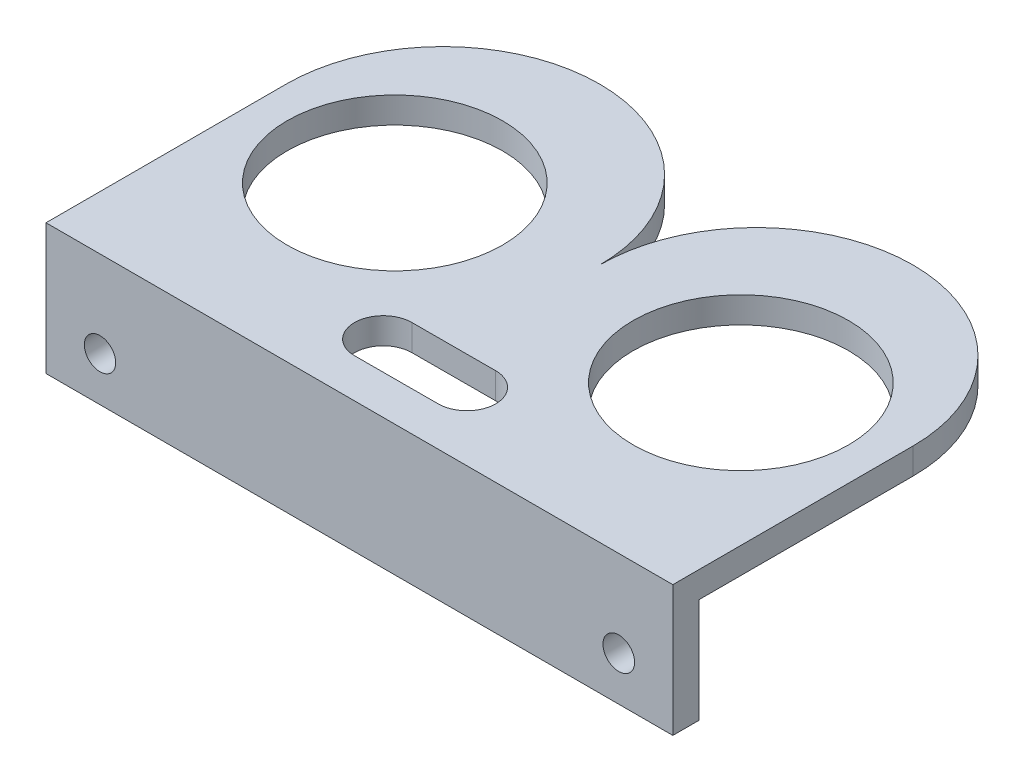
ISO-10303-21;
HEADER;
FILE_DESCRIPTION(('STEP AP214'),'2;1');
FILE_NAME('part.step','',(''),(''),'','','');
FILE_SCHEMA(('AUTOMOTIVE_DESIGN { 1 0 10303 214 1 1 1 1 }'));
ENDSEC;
DATA;
#1=APPLICATION_CONTEXT('core data for automotive mechanical design processes');
#2=APPLICATION_PROTOCOL_DEFINITION('international standard','automotive_design',2000,#1);
#3=PRODUCT_CONTEXT('',#1,'mechanical');
#4=PRODUCT('Part','Part','',(#3));
#5=PRODUCT_RELATED_PRODUCT_CATEGORY('part','',(#4));
#6=PRODUCT_DEFINITION_FORMATION('','',#4);
#7=PRODUCT_DEFINITION_CONTEXT('part definition',#1,'design');
#8=PRODUCT_DEFINITION('design','',#6,#7);
#9=PRODUCT_DEFINITION_SHAPE('','',#8);
#10=(LENGTH_UNIT() NAMED_UNIT(*) SI_UNIT(.MILLI.,.METRE.));
#11=(NAMED_UNIT(*) PLANE_ANGLE_UNIT() SI_UNIT($,.RADIAN.));
#12=(NAMED_UNIT(*) SI_UNIT($,.STERADIAN.) SOLID_ANGLE_UNIT());
#13=UNCERTAINTY_MEASURE_WITH_UNIT(LENGTH_MEASURE(1.E-05),#10,'distance_accuracy_value','');
#14=(GEOMETRIC_REPRESENTATION_CONTEXT(3) GLOBAL_UNCERTAINTY_ASSIGNED_CONTEXT((#13)) GLOBAL_UNIT_ASSIGNED_CONTEXT((#10,
#11,#12)) REPRESENTATION_CONTEXT('',''));
#15=CARTESIAN_POINT('',(0.,0.,0.));
#16=DIRECTION('',(0.,0.,1.));
#17=DIRECTION('',(1.,0.,0.));
#18=AXIS2_PLACEMENT_3D('',#15,#16,#17);
#19=CARTESIAN_POINT('',(0.,0.,-2.));
#20=DIRECTION('',(0.,0.,1.));
#21=DIRECTION('',(1.,0.,0.));
#22=AXIS2_PLACEMENT_3D('',#19,#20,#21);
#23=PLANE('',#22);
#24=CARTESIAN_POINT('',(-19.8645981954829,-1.61660108619209,-2.));
#25=DIRECTION('',(0.,0.,1.));
#26=DIRECTION('',(1.,0.,0.));
#27=AXIS2_PLACEMENT_3D('',#24,#25,#26);
#28=CIRCLE('',#27,1.2);
#29=CARTESIAN_POINT('',(-21.0645981954829,-1.61660108619209,-2.));
#30=VERTEX_POINT('',#29);
#31=EDGE_CURVE('E279',#30,#30,#28,.F.);
#32=ORIENTED_EDGE('',*,*,#31,.F.);
#33=EDGE_LOOP('',(#32));
#34=FACE_BOUND('',#33,.T.);
#35=CARTESIAN_POINT('',(19.86,-1.61660108619209,-2.));
#36=DIRECTION('',(0.,0.,1.));
#37=DIRECTION('',(1.,0.,0.));
#38=AXIS2_PLACEMENT_3D('',#35,#36,#37);
#39=CIRCLE('',#38,1.2118940059743);
#40=CARTESIAN_POINT('',(18.6481059940257,-1.61660108619209,-2.));
#41=VERTEX_POINT('',#40);
#42=EDGE_CURVE('E269',#41,#41,#39,.F.);
#43=ORIENTED_EDGE('',*,*,#42,.F.);
#44=EDGE_LOOP('',(#43));
#45=FACE_BOUND('',#44,.T.);
#46=DIRECTION('',(-1.,0.,0.));
#47=VECTOR('',#46,1.);
#48=CARTESIAN_POINT('',(-24.,3.,-2.));
#49=LINE('',#48,#47);
#50=CARTESIAN_POINT('',(24.,3.,-2.));
#51=VERTEX_POINT('',#50);
#52=CARTESIAN_POINT('',(-24.,3.,-2.));
#53=VERTEX_POINT('',#52);
#54=EDGE_CURVE('E199',#51,#53,#49,.T.);
#55=ORIENTED_EDGE('',*,*,#54,.F.);
#56=DIRECTION('',(0.,1.,0.));
#57=VECTOR('',#56,1.);
#58=CARTESIAN_POINT('',(24.,5.,-2.));
#59=LINE('',#58,#57);
#60=CARTESIAN_POINT('',(24.,-5.,-2.));
#61=VERTEX_POINT('',#60);
#62=EDGE_CURVE('E221',#61,#51,#59,.T.);
#63=ORIENTED_EDGE('',*,*,#62,.F.);
#64=DIRECTION('',(1.,0.,0.));
#65=VECTOR('',#64,1.);
#66=CARTESIAN_POINT('',(-24.,-5.,-2.));
#67=LINE('',#66,#65);
#68=CARTESIAN_POINT('',(-24.,-5.,-2.));
#69=VERTEX_POINT('',#68);
#70=EDGE_CURVE('E229',#69,#61,#67,.T.);
#71=ORIENTED_EDGE('',*,*,#70,.F.);
#72=DIRECTION('',(0.,-1.,0.));
#73=VECTOR('',#72,1.);
#74=CARTESIAN_POINT('',(-24.,5.,-2.));
#75=LINE('',#74,#73);
#76=EDGE_CURVE('E225',#53,#69,#75,.T.);
#77=ORIENTED_EDGE('',*,*,#76,.F.);
#78=EDGE_LOOP('',(#55,#63,#71,#77));
#79=FACE_BOUND('',#78,.T.);
#80=ADVANCED_FACE('F45',(#34,#45,#79),#23,.F.);
#81=CARTESIAN_POINT('',(24.,5.,-2.));
#82=DIRECTION('',(1.,0.,0.));
#83=DIRECTION('',(0.,1.,0.));
#84=AXIS2_PLACEMENT_3D('',#81,#82,#83);
#85=PLANE('',#84);
#86=DIRECTION('',(0.,1.,0.));
#87=VECTOR('',#86,1.);
#88=CARTESIAN_POINT('',(24.,5.,0.));
#89=LINE('',#88,#87);
#90=CARTESIAN_POINT('',(24.,-5.,0.));
#91=VERTEX_POINT('',#90);
#92=CARTESIAN_POINT('',(24.,5.,0.));
#93=VERTEX_POINT('',#92);
#94=EDGE_CURVE('E214',#91,#93,#89,.T.);
#95=ORIENTED_EDGE('',*,*,#94,.F.);
#96=DIRECTION('',(0.,0.,1.));
#97=VECTOR('',#96,1.);
#98=CARTESIAN_POINT('',(24.,-5.,-2.));
#99=LINE('',#98,#97);
#100=EDGE_CURVE('E248',#61,#91,#99,.T.);
#101=ORIENTED_EDGE('',*,*,#100,.F.);
#102=ORIENTED_EDGE('',*,*,#62,.T.);
#103=DIRECTION('',(0.,0.,-1.));
#104=VECTOR('',#103,1.);
#105=CARTESIAN_POINT('',(24.,3.,-2.));
#106=LINE('',#105,#104);
#107=CARTESIAN_POINT('',(24.,3.,-18.3975681348056));
#108=VERTEX_POINT('',#107);
#109=EDGE_CURVE('E183',#51,#108,#106,.T.);
#110=ORIENTED_EDGE('',*,*,#109,.T.);
#111=DIRECTION('',(0.,1.,0.));
#112=VECTOR('',#111,1.);
#113=CARTESIAN_POINT('',(24.,3.,-18.3975681348056));
#114=LINE('',#113,#112);
#115=CARTESIAN_POINT('',(24.,5.,-18.3975681348056));
#116=VERTEX_POINT('',#115);
#117=EDGE_CURVE('E203',#108,#116,#114,.T.);
#118=ORIENTED_EDGE('',*,*,#117,.T.);
#119=DIRECTION('',(0.,0.,1.));
#120=VECTOR('',#119,1.);
#121=CARTESIAN_POINT('',(24.,5.,-2.));
#122=LINE('',#121,#120);
#123=EDGE_CURVE('E233',#116,#93,#122,.T.);
#124=ORIENTED_EDGE('',*,*,#123,.T.);
#125=EDGE_LOOP('',(#95,#101,#102,#110,#118,#124));
#126=FACE_BOUND('',#125,.T.);
#127=ADVANCED_FACE('F47',(#126),#85,.T.);
#128=CARTESIAN_POINT('',(-24.,-5.,-2.));
#129=DIRECTION('',(0.,-1.,0.));
#130=DIRECTION('',(0.,0.,-1.));
#131=AXIS2_PLACEMENT_3D('',#128,#129,#130);
#132=PLANE('',#131);
#133=DIRECTION('',(1.,0.,0.));
#134=VECTOR('',#133,1.);
#135=CARTESIAN_POINT('',(-24.,-5.,0.));
#136=LINE('',#135,#134);
#137=CARTESIAN_POINT('',(-24.,-5.,0.));
#138=VERTEX_POINT('',#137);
#139=EDGE_CURVE('E226',#138,#91,#136,.T.);
#140=ORIENTED_EDGE('',*,*,#139,.F.);
#141=DIRECTION('',(0.,0.,1.));
#142=VECTOR('',#141,1.);
#143=CARTESIAN_POINT('',(-24.,-5.,-2.));
#144=LINE('',#143,#142);
#145=EDGE_CURVE('E252',#69,#138,#144,.T.);
#146=ORIENTED_EDGE('',*,*,#145,.F.);
#147=ORIENTED_EDGE('',*,*,#70,.T.);
#148=ORIENTED_EDGE('',*,*,#100,.T.);
#149=EDGE_LOOP('',(#140,#146,#147,#148));
#150=FACE_BOUND('',#149,.T.);
#151=ADVANCED_FACE('F314',(#150),#132,.T.);
#152=CARTESIAN_POINT('',(-24.,5.,-2.));
#153=DIRECTION('',(-1.,0.,0.));
#154=DIRECTION('',(0.,0.,1.));
#155=AXIS2_PLACEMENT_3D('',#152,#153,#154);
#156=PLANE('',#155);
#157=DIRECTION('',(0.,-1.,0.));
#158=VECTOR('',#157,1.);
#159=CARTESIAN_POINT('',(-24.,5.,0.));
#160=LINE('',#159,#158);
#161=CARTESIAN_POINT('',(-24.,5.,0.));
#162=VERTEX_POINT('',#161);
#163=EDGE_CURVE('E241',#162,#138,#160,.T.);
#164=ORIENTED_EDGE('',*,*,#163,.F.);
#165=DIRECTION('',(0.,0.,1.));
#166=VECTOR('',#165,1.);
#167=CARTESIAN_POINT('',(-24.,5.,-2.));
#168=LINE('',#167,#166);
#169=CARTESIAN_POINT('',(-24.,5.,-18.3975681348056));
#170=VERTEX_POINT('',#169);
#171=EDGE_CURVE('E255',#170,#162,#168,.T.);
#172=ORIENTED_EDGE('',*,*,#171,.F.);
#173=DIRECTION('',(0.,1.,0.));
#174=VECTOR('',#173,1.);
#175=CARTESIAN_POINT('',(-24.,3.,-18.3975681348056));
#176=LINE('',#175,#174);
#177=CARTESIAN_POINT('',(-24.,3.,-18.3975681348056));
#178=VERTEX_POINT('',#177);
#179=EDGE_CURVE('E210',#178,#170,#176,.T.);
#180=ORIENTED_EDGE('',*,*,#179,.F.);
#181=DIRECTION('',(0.,0.,-1.));
#182=VECTOR('',#181,1.);
#183=CARTESIAN_POINT('',(-24.,3.,-2.));
#184=LINE('',#183,#182);
#185=EDGE_CURVE('E196',#53,#178,#184,.T.);
#186=ORIENTED_EDGE('',*,*,#185,.F.);
#187=ORIENTED_EDGE('',*,*,#76,.T.);
#188=ORIENTED_EDGE('',*,*,#145,.T.);
#189=EDGE_LOOP('',(#164,#172,#180,#186,#187,#188));
#190=FACE_BOUND('',#189,.T.);
#191=ADVANCED_FACE('F316',(#190),#156,.T.);
#192=CARTESIAN_POINT('',(-24.,5.,-2.));
#193=DIRECTION('',(0.,1.,0.));
#194=DIRECTION('',(0.,0.,1.));
#195=AXIS2_PLACEMENT_3D('',#192,#193,#194);
#196=PLANE('',#195);
#197=CARTESIAN_POINT('',(-3.3694128577521,5.,-5.19393383521261));
#198=DIRECTION('',(0.,1.,0.));
#199=DIRECTION('',(0.,0.,1.));
#200=AXIS2_PLACEMENT_3D('',#197,#198,#199);
#201=CIRCLE('',#200,2.2);
#202=CARTESIAN_POINT('',(-3.37358064124707,5.,-7.39392988738651));
#203=VERTEX_POINT('',#202);
#204=CARTESIAN_POINT('',(-3.36524507425715,5.,-2.99393778303871));
#205=VERTEX_POINT('',#204);
#206=EDGE_CURVE('E63',#203,#205,#201,.T.);
#207=ORIENTED_EDGE('',*,*,#206,.F.);
#208=DIRECTION('',(-0.99999820553359,0.,0.00189444704316285));
#209=VECTOR('',#208,1.);
#210=CARTESIAN_POINT('',(-3.37358064124707,5.,-7.39392988738651));
#211=LINE('',#210,#209);
#212=CARTESIAN_POINT('',(3.02639354089853,5.,-7.40605432130908));
#213=VERTEX_POINT('',#212);
#214=EDGE_CURVE('E152',#213,#203,#211,.T.);
#215=ORIENTED_EDGE('',*,*,#214,.F.);
#216=CARTESIAN_POINT('',(3.03056132439349,5.,-5.20605826913519));
#217=DIRECTION('',(0.,1.,0.));
#218=DIRECTION('',(0.,0.,-1.));
#219=AXIS2_PLACEMENT_3D('',#216,#217,#218);
#220=CIRCLE('',#219,2.2);
#221=CARTESIAN_POINT('',(3.03472910788845,5.,-3.00606221696129));
#222=VERTEX_POINT('',#221);
#223=EDGE_CURVE('E134',#222,#213,#220,.T.);
#224=ORIENTED_EDGE('',*,*,#223,.F.);
#225=DIRECTION('',(0.99999820553359,0.,-0.00189444704316285));
#226=VECTOR('',#225,1.);
#227=CARTESIAN_POINT('',(-3.36524507425715,5.,-2.99393778303871));
#228=LINE('',#227,#226);
#229=EDGE_CURVE('E144',#205,#222,#228,.T.);
#230=ORIENTED_EDGE('',*,*,#229,.F.);
#231=EDGE_LOOP('',(#207,#215,#224,#230));
#232=FACE_BOUND('',#231,.T.);
#233=CARTESIAN_POINT('',(-13.2865314064832,5.,-15.9964745083174));
#234=DIRECTION('',(0.,1.,0.));
#235=DIRECTION('',(0.,0.,1.));
#236=AXIS2_PLACEMENT_3D('',#233,#234,#235);
#237=CIRCLE('',#236,8.25);
#238=CARTESIAN_POINT('',(-13.2865314064832,5.,-7.74647450831738));
#239=VERTEX_POINT('',#238);
#240=EDGE_CURVE('E172',#239,#239,#237,.T.);
#241=ORIENTED_EDGE('',*,*,#240,.F.);
#242=EDGE_LOOP('',(#241));
#243=FACE_BOUND('',#242,.T.);
#244=CARTESIAN_POINT('',(13.2134685935168,5.,-15.9964745083174));
#245=DIRECTION('',(0.,1.,0.));
#246=DIRECTION('',(0.,0.,1.));
#247=AXIS2_PLACEMENT_3D('',#244,#245,#246);
#248=CIRCLE('',#247,8.25);
#249=CARTESIAN_POINT('',(13.2134685935168,5.,-7.74647450831737));
#250=VERTEX_POINT('',#249);
#251=EDGE_CURVE('E176',#250,#250,#248,.T.);
#252=ORIENTED_EDGE('',*,*,#251,.F.);
#253=EDGE_LOOP('',(#252));
#254=FACE_BOUND('',#253,.T.);
#255=DIRECTION('',(-1.,0.,0.));
#256=VECTOR('',#255,1.);
#257=CARTESIAN_POINT('',(-24.,5.,0.));
#258=LINE('',#257,#256);
#259=EDGE_CURVE('E237',#93,#162,#258,.T.);
#260=ORIENTED_EDGE('',*,*,#259,.F.);
#261=ORIENTED_EDGE('',*,*,#123,.F.);
#262=CARTESIAN_POINT('',(12.,5.,-18.3975681348056));
#263=DIRECTION('',(0.,1.,0.));
#264=DIRECTION('',(0.,0.,1.));
#265=AXIS2_PLACEMENT_3D('',#262,#263,#264);
#266=CIRCLE('',#265,12.);
#267=CARTESIAN_POINT('',(0.,5.,-18.3975681348056));
#268=VERTEX_POINT('',#267);
#269=EDGE_CURVE('E171',#116,#268,#266,.T.);
#270=ORIENTED_EDGE('',*,*,#269,.T.);
#271=CARTESIAN_POINT('',(-12.,5.,-18.3975681348056));
#272=DIRECTION('',(0.,1.,0.));
#273=DIRECTION('',(0.,0.,1.));
#274=AXIS2_PLACEMENT_3D('',#271,#272,#273);
#275=CIRCLE('',#274,12.);
#276=EDGE_CURVE('E188',#268,#170,#275,.T.);
#277=ORIENTED_EDGE('',*,*,#276,.T.);
#278=ORIENTED_EDGE('',*,*,#171,.T.);
#279=EDGE_LOOP('',(#260,#261,#270,#277,#278));
#280=FACE_BOUND('',#279,.T.);
#281=ADVANCED_FACE('F149',(#232,#243,#254,#280),#196,.T.);
#282=CARTESIAN_POINT('',(0.,0.,0.));
#283=DIRECTION('',(0.,0.,1.));
#284=DIRECTION('',(1.,0.,0.));
#285=AXIS2_PLACEMENT_3D('',#282,#283,#284);
#286=PLANE('',#285);
#287=CARTESIAN_POINT('',(-19.8645981954829,-1.61660108619209,0.));
#288=DIRECTION('',(0.,0.,1.));
#289=DIRECTION('',(1.,0.,0.));
#290=AXIS2_PLACEMENT_3D('',#287,#288,#289);
#291=CIRCLE('',#290,1.2);
#292=CARTESIAN_POINT('',(-21.0645981954829,-1.61660108619209,0.));
#293=VERTEX_POINT('',#292);
#294=EDGE_CURVE('E49',#293,#293,#291,.F.);
#295=ORIENTED_EDGE('',*,*,#294,.T.);
#296=EDGE_LOOP('',(#295));
#297=FACE_BOUND('',#296,.T.);
#298=CARTESIAN_POINT('',(19.86,-1.61660108619209,0.));
#299=DIRECTION('',(0.,0.,1.));
#300=DIRECTION('',(1.,0.,0.));
#301=AXIS2_PLACEMENT_3D('',#298,#299,#300);
#302=CIRCLE('',#301,1.2118940059743);
#303=CARTESIAN_POINT('',(18.6481059940257,-1.61660108619209,0.));
#304=VERTEX_POINT('',#303);
#305=EDGE_CURVE('E266',#304,#304,#302,.F.);
#306=ORIENTED_EDGE('',*,*,#305,.T.);
#307=EDGE_LOOP('',(#306));
#308=FACE_BOUND('',#307,.T.);
#309=ORIENTED_EDGE('',*,*,#94,.T.);
#310=ORIENTED_EDGE('',*,*,#259,.T.);
#311=ORIENTED_EDGE('',*,*,#163,.T.);
#312=ORIENTED_EDGE('',*,*,#139,.T.);
#313=EDGE_LOOP('',(#309,#310,#311,#312));
#314=FACE_BOUND('',#313,.T.);
#315=ADVANCED_FACE('F310',(#297,#308,#314),#286,.T.);
#316=CARTESIAN_POINT('',(-12.,3.,-18.3975681348056));
#317=DIRECTION('',(0.,1.,0.));
#318=DIRECTION('',(0.,0.,1.));
#319=AXIS2_PLACEMENT_3D('',#316,#317,#318);
#320=CYLINDRICAL_SURFACE('',#319,12.);
#321=ORIENTED_EDGE('',*,*,#276,.F.);
#322=DIRECTION('',(0.,1.,0.));
#323=VECTOR('',#322,1.);
#324=CARTESIAN_POINT('',(0.,3.,-18.3975681348056));
#325=LINE('',#324,#323);
#326=CARTESIAN_POINT('',(0.,3.,-18.3975681348056));
#327=VERTEX_POINT('',#326);
#328=EDGE_CURVE('E215',#327,#268,#325,.T.);
#329=ORIENTED_EDGE('',*,*,#328,.F.);
#330=CARTESIAN_POINT('',(-12.,3.,-18.3975681348056));
#331=DIRECTION('',(0.,1.,0.));
#332=DIRECTION('',(0.,0.,1.));
#333=AXIS2_PLACEMENT_3D('',#330,#331,#332);
#334=CIRCLE('',#333,12.);
#335=EDGE_CURVE('E192',#327,#178,#334,.T.);
#336=ORIENTED_EDGE('',*,*,#335,.T.);
#337=ORIENTED_EDGE('',*,*,#179,.T.);
#338=EDGE_LOOP('',(#321,#329,#336,#337));
#339=FACE_BOUND('',#338,.T.);
#340=ADVANCED_FACE('F319',(#339),#320,.T.);
#341=CARTESIAN_POINT('',(12.,3.,-18.3975681348056));
#342=DIRECTION('',(0.,1.,0.));
#343=DIRECTION('',(0.,0.,1.));
#344=AXIS2_PLACEMENT_3D('',#341,#342,#343);
#345=CYLINDRICAL_SURFACE('',#344,12.);
#346=ORIENTED_EDGE('',*,*,#269,.F.);
#347=ORIENTED_EDGE('',*,*,#117,.F.);
#348=CARTESIAN_POINT('',(12.,3.,-18.3975681348056));
#349=DIRECTION('',(0.,1.,0.));
#350=DIRECTION('',(0.,0.,1.));
#351=AXIS2_PLACEMENT_3D('',#348,#349,#350);
#352=CIRCLE('',#351,12.);
#353=EDGE_CURVE('E187',#108,#327,#352,.T.);
#354=ORIENTED_EDGE('',*,*,#353,.T.);
#355=ORIENTED_EDGE('',*,*,#328,.T.);
#356=EDGE_LOOP('',(#346,#347,#354,#355));
#357=FACE_BOUND('',#356,.T.);
#358=ADVANCED_FACE('F304',(#357),#345,.T.);
#359=CARTESIAN_POINT('',(12.,3.,-18.3975681348056));
#360=DIRECTION('',(0.,1.,0.));
#361=DIRECTION('',(0.,0.,1.));
#362=AXIS2_PLACEMENT_3D('',#359,#360,#361);
#363=PLANE('',#362);
#364=DIRECTION('',(-0.99999820553359,0.,0.00189444704316285));
#365=VECTOR('',#364,1.);
#366=CARTESIAN_POINT('',(12.0207905978361,3.,-7.42309376079533));
#367=LINE('',#366,#365);
#368=CARTESIAN_POINT('',(3.02639354089853,3.,-7.40605432130908));
#369=VERTEX_POINT('',#368);
#370=CARTESIAN_POINT('',(-3.37358064124707,3.,-7.39392988738651));
#371=VERTEX_POINT('',#370);
#372=EDGE_CURVE('E55',#369,#371,#367,.T.);
#373=ORIENTED_EDGE('',*,*,#372,.T.);
#374=CARTESIAN_POINT('',(-3.3694128577521,3.,-5.19393383521261));
#375=DIRECTION('',(0.,1.,0.));
#376=DIRECTION('',(0.,0.,1.));
#377=AXIS2_PLACEMENT_3D('',#374,#375,#376);
#378=CIRCLE('',#377,2.2);
#379=CARTESIAN_POINT('',(-3.36524507425715,3.,-2.99393778303871));
#380=VERTEX_POINT('',#379);
#381=EDGE_CURVE('E11',#371,#380,#378,.T.);
#382=ORIENTED_EDGE('',*,*,#381,.T.);
#383=DIRECTION('',(0.99999820553359,0.,-0.00189444704316285));
#384=VECTOR('',#383,1.);
#385=CARTESIAN_POINT('',(12.0291261648261,3.,-3.02310165644753));
#386=LINE('',#385,#384);
#387=CARTESIAN_POINT('',(3.03472910788845,3.,-3.00606221696128));
#388=VERTEX_POINT('',#387);
#389=EDGE_CURVE('E251',#380,#388,#386,.T.);
#390=ORIENTED_EDGE('',*,*,#389,.T.);
#391=CARTESIAN_POINT('',(3.03056132439349,3.,-5.20605826913519));
#392=DIRECTION('',(0.,1.,0.));
#393=DIRECTION('',(0.,0.,1.));
#394=AXIS2_PLACEMENT_3D('',#391,#392,#393);
#395=CIRCLE('',#394,2.2);
#396=EDGE_CURVE('E137',#388,#369,#395,.T.);
#397=ORIENTED_EDGE('',*,*,#396,.T.);
#398=EDGE_LOOP('',(#373,#382,#390,#397));
#399=FACE_BOUND('',#398,.T.);
#400=CARTESIAN_POINT('',(-13.2865314064832,3.,-15.9964745083174));
#401=DIRECTION('',(0.,1.,0.));
#402=DIRECTION('',(0.,0.,1.));
#403=AXIS2_PLACEMENT_3D('',#400,#401,#402);
#404=CIRCLE('',#403,8.25);
#405=CARTESIAN_POINT('',(-13.2865314064832,3.,-7.74647450831738));
#406=VERTEX_POINT('',#405);
#407=EDGE_CURVE('E167',#406,#406,#404,.T.);
#408=ORIENTED_EDGE('',*,*,#407,.T.);
#409=EDGE_LOOP('',(#408));
#410=FACE_BOUND('',#409,.T.);
#411=CARTESIAN_POINT('',(13.2134685935168,3.,-15.9964745083174));
#412=DIRECTION('',(0.,1.,0.));
#413=DIRECTION('',(0.,0.,1.));
#414=AXIS2_PLACEMENT_3D('',#411,#412,#413);
#415=CIRCLE('',#414,8.25);
#416=CARTESIAN_POINT('',(13.2134685935168,3.,-7.74647450831737));
#417=VERTEX_POINT('',#416);
#418=EDGE_CURVE('E162',#417,#417,#415,.T.);
#419=ORIENTED_EDGE('',*,*,#418,.T.);
#420=EDGE_LOOP('',(#419));
#421=FACE_BOUND('',#420,.T.);
#422=ORIENTED_EDGE('',*,*,#109,.F.);
#423=ORIENTED_EDGE('',*,*,#54,.T.);
#424=ORIENTED_EDGE('',*,*,#185,.T.);
#425=ORIENTED_EDGE('',*,*,#335,.F.);
#426=ORIENTED_EDGE('',*,*,#353,.F.);
#427=EDGE_LOOP('',(#422,#423,#424,#425,#426));
#428=FACE_BOUND('',#427,.T.);
#429=ADVANCED_FACE('F300',(#399,#410,#421,#428),#363,.F.);
#430=CARTESIAN_POINT('',(13.2134685935168,3.,-15.9964745083174));
#431=DIRECTION('',(0.,1.,0.));
#432=DIRECTION('',(0.,0.,1.));
#433=AXIS2_PLACEMENT_3D('',#430,#431,#432);
#434=CYLINDRICAL_SURFACE('',#433,8.25);
#435=ORIENTED_EDGE('',*,*,#418,.F.);
#436=EDGE_LOOP('',(#435));
#437=FACE_BOUND('',#436,.T.);
#438=ORIENTED_EDGE('',*,*,#251,.T.);
#439=EDGE_LOOP('',(#438));
#440=FACE_BOUND('',#439,.T.);
#441=ADVANCED_FACE('F350',(#437,#440),#434,.F.);
#442=CARTESIAN_POINT('',(-13.2865314064832,3.,-15.9964745083174));
#443=DIRECTION('',(0.,1.,0.));
#444=DIRECTION('',(0.,0.,1.));
#445=AXIS2_PLACEMENT_3D('',#442,#443,#444);
#446=CYLINDRICAL_SURFACE('',#445,8.25);
#447=ORIENTED_EDGE('',*,*,#407,.F.);
#448=EDGE_LOOP('',(#447));
#449=FACE_BOUND('',#448,.T.);
#450=ORIENTED_EDGE('',*,*,#240,.T.);
#451=EDGE_LOOP('',(#450));
#452=FACE_BOUND('',#451,.T.);
#453=ADVANCED_FACE('F343',(#449,#452),#446,.F.);
#454=CARTESIAN_POINT('',(-3.3694128577521,-5.,-5.19393383521261));
#455=DIRECTION('',(0.,1.,0.));
#456=DIRECTION('',(0.,0.,1.));
#457=AXIS2_PLACEMENT_3D('',#454,#455,#456);
#458=CYLINDRICAL_SURFACE('',#457,2.2);
#459=DIRECTION('',(0.,1.,0.));
#460=VECTOR('',#459,1.);
#461=CARTESIAN_POINT('',(-3.37358064124707,-5.,-7.39392988738651));
#462=LINE('',#461,#460);
#463=EDGE_CURVE('E159',#371,#203,#462,.T.);
#464=ORIENTED_EDGE('',*,*,#463,.T.);
#465=ORIENTED_EDGE('',*,*,#206,.T.);
#466=DIRECTION('',(0.,1.,0.));
#467=VECTOR('',#466,1.);
#468=CARTESIAN_POINT('',(-3.36524507425715,-5.,-2.99393778303871));
#469=LINE('',#468,#467);
#470=EDGE_CURVE('E141',#380,#205,#469,.T.);
#471=ORIENTED_EDGE('',*,*,#470,.F.);
#472=ORIENTED_EDGE('',*,*,#381,.F.);
#473=EDGE_LOOP('',(#464,#465,#471,#472));
#474=FACE_BOUND('',#473,.T.);
#475=ADVANCED_FACE('F356',(#474),#458,.F.);
#476=CARTESIAN_POINT('',(-3.37358064124707,-5.,-7.39392988738651));
#477=DIRECTION('',(-0.00189444704316285,0.,-0.99999820553359));
#478=DIRECTION('',(-0.99999820553359,0.,0.00189444704316285));
#479=AXIS2_PLACEMENT_3D('',#476,#477,#478);
#480=PLANE('',#479);
#481=DIRECTION('',(0.,1.,0.));
#482=VECTOR('',#481,1.);
#483=CARTESIAN_POINT('',(3.02639354089853,-5.,-7.40605432130908));
#484=LINE('',#483,#482);
#485=EDGE_CURVE('E140',#369,#213,#484,.T.);
#486=ORIENTED_EDGE('',*,*,#485,.T.);
#487=ORIENTED_EDGE('',*,*,#214,.T.);
#488=ORIENTED_EDGE('',*,*,#463,.F.);
#489=ORIENTED_EDGE('',*,*,#372,.F.);
#490=EDGE_LOOP('',(#486,#487,#488,#489));
#491=FACE_BOUND('',#490,.T.);
#492=ADVANCED_FACE('F360',(#491),#480,.F.);
#493=CARTESIAN_POINT('',(3.03056132439349,-5.,-5.20605826913519));
#494=DIRECTION('',(0.,1.,0.));
#495=DIRECTION('',(0.,0.,1.));
#496=AXIS2_PLACEMENT_3D('',#493,#494,#495);
#497=CYLINDRICAL_SURFACE('',#496,2.2);
#498=DIRECTION('',(0.,1.,0.));
#499=VECTOR('',#498,1.);
#500=CARTESIAN_POINT('',(3.03472910788845,-5.,-3.00606221696129));
#501=LINE('',#500,#499);
#502=EDGE_CURVE('E71',#388,#222,#501,.T.);
#503=ORIENTED_EDGE('',*,*,#502,.T.);
#504=ORIENTED_EDGE('',*,*,#223,.T.);
#505=ORIENTED_EDGE('',*,*,#485,.F.);
#506=ORIENTED_EDGE('',*,*,#396,.F.);
#507=EDGE_LOOP('',(#503,#504,#505,#506));
#508=FACE_BOUND('',#507,.T.);
#509=ADVANCED_FACE('F131',(#508),#497,.F.);
#510=CARTESIAN_POINT('',(-3.36524507425715,-5.,-2.99393778303871));
#511=DIRECTION('',(0.00189444704316285,0.,0.99999820553359));
#512=DIRECTION('',(0.99999820553359,0.,-0.00189444704316285));
#513=AXIS2_PLACEMENT_3D('',#510,#511,#512);
#514=PLANE('',#513);
#515=ORIENTED_EDGE('',*,*,#470,.T.);
#516=ORIENTED_EDGE('',*,*,#229,.T.);
#517=ORIENTED_EDGE('',*,*,#502,.F.);
#518=ORIENTED_EDGE('',*,*,#389,.F.);
#519=EDGE_LOOP('',(#515,#516,#517,#518));
#520=FACE_BOUND('',#519,.T.);
#521=ADVANCED_FACE('F145',(#520),#514,.F.);
#522=CARTESIAN_POINT('',(19.86,-1.61660108619209,1.2E-05));
#523=DIRECTION('',(0.,0.,-1.));
#524=DIRECTION('',(-1.,0.,0.));
#525=AXIS2_PLACEMENT_3D('',#522,#523,#524);
#526=CYLINDRICAL_SURFACE('',#525,1.2118940059743);
#527=CARTESIAN_POINT('',(18.6481059940257,-1.61660108619209,0.));
#528=CARTESIAN_POINT('',(18.6481059940257,-1.61660108619209,-0.0208333333333333));
#529=CARTESIAN_POINT('',(18.6481059940257,-1.61660108619209,-0.0416666666666667));
#530=CARTESIAN_POINT('',(18.6481059940257,-1.61660108619209,-0.0833333333333333));
#531=CARTESIAN_POINT('',(18.6481059940257,-1.61660108619209,-0.104166666666667));
#532=CARTESIAN_POINT('',(18.6481059940257,-1.61660108619209,-0.145833333333333));
#533=CARTESIAN_POINT('',(18.6481059940257,-1.61660108619209,-0.166666666666667));
#534=CARTESIAN_POINT('',(18.6481059940257,-1.61660108619209,-0.208333333333333));
#535=CARTESIAN_POINT('',(18.6481059940257,-1.61660108619209,-0.229166666666667));
#536=CARTESIAN_POINT('',(18.6481059940257,-1.61660108619209,-0.270833333333333));
#537=CARTESIAN_POINT('',(18.6481059940257,-1.61660108619209,-0.291666666666667));
#538=CARTESIAN_POINT('',(18.6481059940257,-1.61660108619209,-0.333333333333333));
#539=CARTESIAN_POINT('',(18.6481059940257,-1.61660108619209,-0.354166666666667));
#540=CARTESIAN_POINT('',(18.6481059940257,-1.61660108619209,-0.395833333333333));
#541=CARTESIAN_POINT('',(18.6481059940257,-1.61660108619209,-0.416666666666667));
#542=CARTESIAN_POINT('',(18.6481059940257,-1.61660108619209,-0.458333333333333));
#543=CARTESIAN_POINT('',(18.6481059940257,-1.61660108619209,-0.479166666666667));
#544=CARTESIAN_POINT('',(18.6481059940257,-1.61660108619209,-0.520833333333333));
#545=CARTESIAN_POINT('',(18.6481059940257,-1.61660108619209,-0.541666666666667));
#546=CARTESIAN_POINT('',(18.6481059940257,-1.61660108619209,-0.583333333333333));
#547=CARTESIAN_POINT('',(18.6481059940257,-1.61660108619209,-0.604166666666667));
#548=CARTESIAN_POINT('',(18.6481059940257,-1.61660108619209,-0.645833333333333));
#549=CARTESIAN_POINT('',(18.6481059940257,-1.61660108619209,-0.666666666666667));
#550=CARTESIAN_POINT('',(18.6481059940257,-1.61660108619209,-0.708333333333333));
#551=CARTESIAN_POINT('',(18.6481059940257,-1.61660108619209,-0.729166666666667));
#552=CARTESIAN_POINT('',(18.6481059940257,-1.61660108619209,-0.770833333333333));
#553=CARTESIAN_POINT('',(18.6481059940257,-1.61660108619209,-0.791666666666667));
#554=CARTESIAN_POINT('',(18.6481059940257,-1.61660108619209,-0.833333333333333));
#555=CARTESIAN_POINT('',(18.6481059940257,-1.61660108619209,-0.854166666666667));
#556=CARTESIAN_POINT('',(18.6481059940257,-1.61660108619209,-0.895833333333333));
#557=CARTESIAN_POINT('',(18.6481059940257,-1.61660108619209,-0.916666666666667));
#558=CARTESIAN_POINT('',(18.6481059940257,-1.61660108619209,-0.958333333333333));
#559=CARTESIAN_POINT('',(18.6481059940257,-1.61660108619209,-0.979166666666667));
#560=CARTESIAN_POINT('',(18.6481059940257,-1.61660108619209,-1.02083333333333));
#561=CARTESIAN_POINT('',(18.6481059940257,-1.61660108619209,-1.04166666666667));
#562=CARTESIAN_POINT('',(18.6481059940257,-1.61660108619209,-1.08333333333333));
#563=CARTESIAN_POINT('',(18.6481059940257,-1.61660108619209,-1.10416666666667));
#564=CARTESIAN_POINT('',(18.6481059940257,-1.61660108619209,-1.14583333333333));
#565=CARTESIAN_POINT('',(18.6481059940257,-1.61660108619209,-1.16666666666667));
#566=CARTESIAN_POINT('',(18.6481059940257,-1.61660108619209,-1.20833333333333));
#567=CARTESIAN_POINT('',(18.6481059940257,-1.61660108619209,-1.22916666666667));
#568=CARTESIAN_POINT('',(18.6481059940257,-1.61660108619209,-1.27083333333333));
#569=CARTESIAN_POINT('',(18.6481059940257,-1.61660108619209,-1.29166666666667));
#570=CARTESIAN_POINT('',(18.6481059940257,-1.61660108619209,-1.33333333333333));
#571=CARTESIAN_POINT('',(18.6481059940257,-1.61660108619209,-1.35416666666667));
#572=CARTESIAN_POINT('',(18.6481059940257,-1.61660108619209,-1.39583333333333));
#573=CARTESIAN_POINT('',(18.6481059940257,-1.61660108619209,-1.41666666666667));
#574=CARTESIAN_POINT('',(18.6481059940257,-1.61660108619209,-1.45833333333333));
#575=CARTESIAN_POINT('',(18.6481059940257,-1.61660108619209,-1.47916666666667));
#576=CARTESIAN_POINT('',(18.6481059940257,-1.61660108619209,-1.52083333333333));
#577=CARTESIAN_POINT('',(18.6481059940257,-1.61660108619209,-1.54166666666667));
#578=CARTESIAN_POINT('',(18.6481059940257,-1.61660108619209,-1.58333333333333));
#579=CARTESIAN_POINT('',(18.6481059940257,-1.61660108619209,-1.60416666666667));
#580=CARTESIAN_POINT('',(18.6481059940257,-1.61660108619209,-1.64583333333333));
#581=CARTESIAN_POINT('',(18.6481059940257,-1.61660108619209,-1.66666666666667));
#582=CARTESIAN_POINT('',(18.6481059940257,-1.61660108619209,-1.70833333333333));
#583=CARTESIAN_POINT('',(18.6481059940257,-1.61660108619209,-1.72916666666667));
#584=CARTESIAN_POINT('',(18.6481059940257,-1.61660108619209,-1.77083333333333));
#585=CARTESIAN_POINT('',(18.6481059940257,-1.61660108619209,-1.79166666666667));
#586=CARTESIAN_POINT('',(18.6481059940257,-1.61660108619209,-1.83333333333333));
#587=CARTESIAN_POINT('',(18.6481059940257,-1.61660108619209,-1.85416666666667));
#588=CARTESIAN_POINT('',(18.6481059940257,-1.61660108619209,-1.89583333333333));
#589=CARTESIAN_POINT('',(18.6481059940257,-1.61660108619209,-1.91666666666667));
#590=CARTESIAN_POINT('',(18.6481059940257,-1.61660108619209,-1.95833333333333));
#591=CARTESIAN_POINT('',(18.6481059940257,-1.61660108619209,-1.97916666666667));
#592=CARTESIAN_POINT('',(18.6481059940257,-1.61660108619209,-2.));
#593=B_SPLINE_CURVE_WITH_KNOTS('',3,(#527,#528,#529,#530,#531,#532,#533,#534,#535,#536,#537,
#538,#539,#540,#541,#542,#543,#544,#545,#546,#547,#548,#549,#550,#551,#552,#553,#554,#555,#556,
#557,#558,#559,#560,#561,#562,#563,#564,#565,#566,#567,#568,#569,#570,#571,#572,#573,#574,#575,
#576,#577,#578,#579,#580,#581,#582,#583,#584,#585,#586,#587,#588,#589,#590,#591,#592),
.UNSPECIFIED.,.F.,.F.,(4,2,2,2,2,2,2,2,2,2,2,2,2,2,2,2,2,2,2,2,2,2,2,2,2,2,2,2,2,2,2,2,4),(0.,
0.0625,0.125,0.1875,0.25,0.3125,0.375,0.4375,0.5,0.5625,0.625,0.6875,0.75,0.8125,0.875,0.9375,
1.,1.0625,1.125,1.1875,1.25,1.3125,1.375,1.4375,1.5,1.5625,1.625,1.6875,1.75,1.8125,1.875,
1.9375,2.),.UNSPECIFIED.);
#594=EDGE_CURVE('BSEAM382',#304,#41,#593,.T.);
#595=ORIENTED_EDGE('',*,*,#305,.F.);
#596=ORIENTED_EDGE('',*,*,#42,.T.);
#597=ORIENTED_EDGE('',*,*,#594,.T.);
#598=ORIENTED_EDGE('',*,*,#594,.F.);
#599=EDGE_LOOP('',(#595,#597,#596,#598));
#600=FACE_BOUND('',#599,.T.);
#601=ADVANCED_FACE('F382',(#600),#526,.F.);
#602=CARTESIAN_POINT('',(-19.8645981954829,-1.61660108619209,1.2E-05));
#603=DIRECTION('',(0.,0.,-1.));
#604=DIRECTION('',(-1.,0.,0.));
#605=AXIS2_PLACEMENT_3D('',#602,#603,#604);
#606=CYLINDRICAL_SURFACE('',#605,1.2);
#607=CARTESIAN_POINT('',(-21.0645981954829,-1.61660108619209,0.));
#608=CARTESIAN_POINT('',(-21.0645981954829,-1.61660108619209,-0.0208333333333333));
#609=CARTESIAN_POINT('',(-21.0645981954829,-1.61660108619209,-0.0416666666666667));
#610=CARTESIAN_POINT('',(-21.0645981954829,-1.61660108619209,-0.0833333333333333));
#611=CARTESIAN_POINT('',(-21.0645981954829,-1.61660108619209,-0.104166666666667));
#612=CARTESIAN_POINT('',(-21.0645981954829,-1.61660108619209,-0.145833333333333));
#613=CARTESIAN_POINT('',(-21.0645981954829,-1.61660108619209,-0.166666666666667));
#614=CARTESIAN_POINT('',(-21.0645981954829,-1.61660108619209,-0.208333333333333));
#615=CARTESIAN_POINT('',(-21.0645981954829,-1.61660108619209,-0.229166666666667));
#616=CARTESIAN_POINT('',(-21.0645981954829,-1.61660108619209,-0.270833333333333));
#617=CARTESIAN_POINT('',(-21.0645981954829,-1.61660108619209,-0.291666666666667));
#618=CARTESIAN_POINT('',(-21.0645981954829,-1.61660108619209,-0.333333333333333));
#619=CARTESIAN_POINT('',(-21.0645981954829,-1.61660108619209,-0.354166666666667));
#620=CARTESIAN_POINT('',(-21.0645981954829,-1.61660108619209,-0.395833333333333));
#621=CARTESIAN_POINT('',(-21.0645981954829,-1.61660108619209,-0.416666666666667));
#622=CARTESIAN_POINT('',(-21.0645981954829,-1.61660108619209,-0.458333333333333));
#623=CARTESIAN_POINT('',(-21.0645981954829,-1.61660108619209,-0.479166666666667));
#624=CARTESIAN_POINT('',(-21.0645981954829,-1.61660108619209,-0.520833333333333));
#625=CARTESIAN_POINT('',(-21.0645981954829,-1.61660108619209,-0.541666666666667));
#626=CARTESIAN_POINT('',(-21.0645981954829,-1.61660108619209,-0.583333333333333));
#627=CARTESIAN_POINT('',(-21.0645981954829,-1.61660108619209,-0.604166666666667));
#628=CARTESIAN_POINT('',(-21.0645981954829,-1.61660108619209,-0.645833333333333));
#629=CARTESIAN_POINT('',(-21.0645981954829,-1.61660108619209,-0.666666666666667));
#630=CARTESIAN_POINT('',(-21.0645981954829,-1.61660108619209,-0.708333333333333));
#631=CARTESIAN_POINT('',(-21.0645981954829,-1.61660108619209,-0.729166666666667));
#632=CARTESIAN_POINT('',(-21.0645981954829,-1.61660108619209,-0.770833333333333));
#633=CARTESIAN_POINT('',(-21.0645981954829,-1.61660108619209,-0.791666666666667));
#634=CARTESIAN_POINT('',(-21.0645981954829,-1.61660108619209,-0.833333333333333));
#635=CARTESIAN_POINT('',(-21.0645981954829,-1.61660108619209,-0.854166666666667));
#636=CARTESIAN_POINT('',(-21.0645981954829,-1.61660108619209,-0.895833333333333));
#637=CARTESIAN_POINT('',(-21.0645981954829,-1.61660108619209,-0.916666666666667));
#638=CARTESIAN_POINT('',(-21.0645981954829,-1.61660108619209,-0.958333333333333));
#639=CARTESIAN_POINT('',(-21.0645981954829,-1.61660108619209,-0.979166666666667));
#640=CARTESIAN_POINT('',(-21.0645981954829,-1.61660108619209,-1.02083333333333));
#641=CARTESIAN_POINT('',(-21.0645981954829,-1.61660108619209,-1.04166666666667));
#642=CARTESIAN_POINT('',(-21.0645981954829,-1.61660108619209,-1.08333333333333));
#643=CARTESIAN_POINT('',(-21.0645981954829,-1.61660108619209,-1.10416666666667));
#644=CARTESIAN_POINT('',(-21.0645981954829,-1.61660108619209,-1.14583333333333));
#645=CARTESIAN_POINT('',(-21.0645981954829,-1.61660108619209,-1.16666666666667));
#646=CARTESIAN_POINT('',(-21.0645981954829,-1.61660108619209,-1.20833333333333));
#647=CARTESIAN_POINT('',(-21.0645981954829,-1.61660108619209,-1.22916666666667));
#648=CARTESIAN_POINT('',(-21.0645981954829,-1.61660108619209,-1.27083333333333));
#649=CARTESIAN_POINT('',(-21.0645981954829,-1.61660108619209,-1.29166666666667));
#650=CARTESIAN_POINT('',(-21.0645981954829,-1.61660108619209,-1.33333333333333));
#651=CARTESIAN_POINT('',(-21.0645981954829,-1.61660108619209,-1.35416666666667));
#652=CARTESIAN_POINT('',(-21.0645981954829,-1.61660108619209,-1.39583333333333));
#653=CARTESIAN_POINT('',(-21.0645981954829,-1.61660108619209,-1.41666666666667));
#654=CARTESIAN_POINT('',(-21.0645981954829,-1.61660108619209,-1.45833333333333));
#655=CARTESIAN_POINT('',(-21.0645981954829,-1.61660108619209,-1.47916666666667));
#656=CARTESIAN_POINT('',(-21.0645981954829,-1.61660108619209,-1.52083333333333));
#657=CARTESIAN_POINT('',(-21.0645981954829,-1.61660108619209,-1.54166666666667));
#658=CARTESIAN_POINT('',(-21.0645981954829,-1.61660108619209,-1.58333333333333));
#659=CARTESIAN_POINT('',(-21.0645981954829,-1.61660108619209,-1.60416666666667));
#660=CARTESIAN_POINT('',(-21.0645981954829,-1.61660108619209,-1.64583333333333));
#661=CARTESIAN_POINT('',(-21.0645981954829,-1.61660108619209,-1.66666666666667));
#662=CARTESIAN_POINT('',(-21.0645981954829,-1.61660108619209,-1.70833333333333));
#663=CARTESIAN_POINT('',(-21.0645981954829,-1.61660108619209,-1.72916666666667));
#664=CARTESIAN_POINT('',(-21.0645981954829,-1.61660108619209,-1.77083333333333));
#665=CARTESIAN_POINT('',(-21.0645981954829,-1.61660108619209,-1.79166666666667));
#666=CARTESIAN_POINT('',(-21.0645981954829,-1.61660108619209,-1.83333333333333));
#667=CARTESIAN_POINT('',(-21.0645981954829,-1.61660108619209,-1.85416666666667));
#668=CARTESIAN_POINT('',(-21.0645981954829,-1.61660108619209,-1.89583333333333));
#669=CARTESIAN_POINT('',(-21.0645981954829,-1.61660108619209,-1.91666666666667));
#670=CARTESIAN_POINT('',(-21.0645981954829,-1.61660108619209,-1.95833333333333));
#671=CARTESIAN_POINT('',(-21.0645981954829,-1.61660108619209,-1.97916666666667));
#672=CARTESIAN_POINT('',(-21.0645981954829,-1.61660108619209,-2.));
#673=B_SPLINE_CURVE_WITH_KNOTS('',3,(#607,#608,#609,#610,#611,#612,#613,#614,#615,#616,#617,
#618,#619,#620,#621,#622,#623,#624,#625,#626,#627,#628,#629,#630,#631,#632,#633,#634,#635,#636,
#637,#638,#639,#640,#641,#642,#643,#644,#645,#646,#647,#648,#649,#650,#651,#652,#653,#654,#655,
#656,#657,#658,#659,#660,#661,#662,#663,#664,#665,#666,#667,#668,#669,#670,#671,#672),
.UNSPECIFIED.,.F.,.F.,(4,2,2,2,2,2,2,2,2,2,2,2,2,2,2,2,2,2,2,2,2,2,2,2,2,2,2,2,2,2,2,2,4),(0.,
0.0625,0.125,0.1875,0.25,0.3125,0.375,0.4375,0.5,0.5625,0.625,0.6875,0.75,0.8125,0.875,0.9375,
1.,1.0625,1.125,1.1875,1.25,1.3125,1.375,1.4375,1.5,1.5625,1.625,1.6875,1.75,1.8125,1.875,
1.9375,2.),.UNSPECIFIED.);
#674=EDGE_CURVE('BSEAM286',#293,#30,#673,.T.);
#675=ORIENTED_EDGE('',*,*,#294,.F.);
#676=ORIENTED_EDGE('',*,*,#31,.T.);
#677=ORIENTED_EDGE('',*,*,#674,.T.);
#678=ORIENTED_EDGE('',*,*,#674,.F.);
#679=EDGE_LOOP('',(#675,#677,#676,#678));
#680=FACE_BOUND('',#679,.T.);
#681=ADVANCED_FACE('F286',(#680),#606,.F.);
#682=CLOSED_SHELL('',(#80,#127,#151,#191,#281,#315,#340,#358,#429,#441,#453,#475,#492,#509,#521,
#601,#681));
#683=MANIFOLD_SOLID_BREP('B2',#682);
#684=ADVANCED_BREP_SHAPE_REPRESENTATION('',(#18,#683),#14);
#685=SHAPE_DEFINITION_REPRESENTATION(#9,#684);
ENDSEC;
END-ISO-10303-21;
